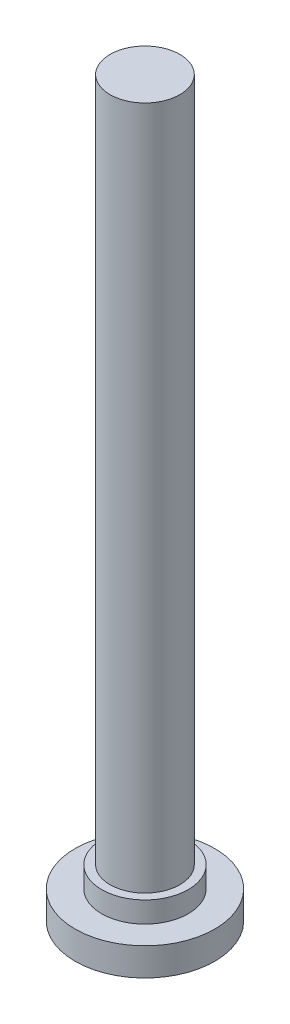
ISO-10303-21;
HEADER;
FILE_DESCRIPTION(('STEP AP214'),'2;1');
FILE_NAME('part.step','',(''),(''),'','','');
FILE_SCHEMA(('AUTOMOTIVE_DESIGN { 1 0 10303 214 1 1 1 1 }'));
ENDSEC;
DATA;
#1=APPLICATION_CONTEXT('core data for automotive mechanical design processes');
#2=APPLICATION_PROTOCOL_DEFINITION('international standard','automotive_design',2000,#1);
#3=PRODUCT_CONTEXT('',#1,'mechanical');
#4=PRODUCT('Part','Part','',(#3));
#5=PRODUCT_RELATED_PRODUCT_CATEGORY('part','',(#4));
#6=PRODUCT_DEFINITION_FORMATION('','',#4);
#7=PRODUCT_DEFINITION_CONTEXT('part definition',#1,'design');
#8=PRODUCT_DEFINITION('design','',#6,#7);
#9=PRODUCT_DEFINITION_SHAPE('','',#8);
#10=(LENGTH_UNIT() NAMED_UNIT(*) SI_UNIT(.MILLI.,.METRE.));
#11=(NAMED_UNIT(*) PLANE_ANGLE_UNIT() SI_UNIT($,.RADIAN.));
#12=(NAMED_UNIT(*) SI_UNIT($,.STERADIAN.) SOLID_ANGLE_UNIT());
#13=UNCERTAINTY_MEASURE_WITH_UNIT(LENGTH_MEASURE(1.E-05),#10,'distance_accuracy_value','');
#14=(GEOMETRIC_REPRESENTATION_CONTEXT(3) GLOBAL_UNCERTAINTY_ASSIGNED_CONTEXT((#13)) GLOBAL_UNIT_ASSIGNED_CONTEXT((#10,
#11,#12)) REPRESENTATION_CONTEXT('',''));
#15=CARTESIAN_POINT('',(0.,0.,0.));
#16=DIRECTION('',(0.,0.,1.));
#17=DIRECTION('',(1.,0.,0.));
#18=AXIS2_PLACEMENT_3D('',#15,#16,#17);
#19=CARTESIAN_POINT('',(0.,-3.5,0.));
#20=DIRECTION('',(0.,-1.,0.));
#21=DIRECTION('',(0.,0.,-1.));
#22=AXIS2_PLACEMENT_3D('',#19,#20,#21);
#23=PLANE('',#22);
#24=CARTESIAN_POINT('',(0.,-3.5,0.));
#25=DIRECTION('',(0.,1.,0.));
#26=DIRECTION('',(0.,0.,-1.));
#27=AXIS2_PLACEMENT_3D('',#24,#25,#26);
#28=CIRCLE('',#27,5.);
#29=CARTESIAN_POINT('',(0.,-3.5,5.));
#30=VERTEX_POINT('',#29);
#31=EDGE_CURVE('E78',#30,#30,#28,.T.);
#32=ORIENTED_EDGE('',*,*,#31,.F.);
#33=EDGE_LOOP('',(#32));
#34=FACE_BOUND('',#33,.T.);
#35=ADVANCED_FACE('F17',(#34),#23,.T.);
#36=CARTESIAN_POINT('',(0.,-1.5,0.));
#37=DIRECTION('',(0.,-1.,0.));
#38=DIRECTION('',(0.,0.,-1.));
#39=AXIS2_PLACEMENT_3D('',#36,#37,#38);
#40=PLANE('',#39);
#41=CARTESIAN_POINT('',(0.,-1.5,0.));
#42=DIRECTION('',(0.,1.,0.));
#43=DIRECTION('',(0.,0.,-1.));
#44=AXIS2_PLACEMENT_3D('',#41,#42,#43);
#45=CIRCLE('',#44,3.1);
#46=CARTESIAN_POINT('',(0.,-1.5,3.1));
#47=VERTEX_POINT('',#46);
#48=EDGE_CURVE('E21',#47,#47,#45,.T.);
#49=ORIENTED_EDGE('',*,*,#48,.F.);
#50=EDGE_LOOP('',(#49));
#51=FACE_BOUND('',#50,.T.);
#52=CARTESIAN_POINT('',(0.,-1.5,0.));
#53=DIRECTION('',(0.,-1.,0.));
#54=DIRECTION('',(0.,0.,-1.));
#55=AXIS2_PLACEMENT_3D('',#52,#53,#54);
#56=CIRCLE('',#55,5.);
#57=CARTESIAN_POINT('',(0.,-1.5,5.));
#58=VERTEX_POINT('',#57);
#59=EDGE_CURVE('E11',#58,#58,#56,.T.);
#60=ORIENTED_EDGE('',*,*,#59,.F.);
#61=EDGE_LOOP('',(#60));
#62=FACE_BOUND('',#61,.T.);
#63=ADVANCED_FACE('F19',(#51,#62),#40,.F.);
#64=CARTESIAN_POINT('',(0.,0.,0.));
#65=DIRECTION('',(0.,-1.,0.));
#66=DIRECTION('',(0.,0.,-1.));
#67=AXIS2_PLACEMENT_3D('',#64,#65,#66);
#68=PLANE('',#67);
#69=CARTESIAN_POINT('',(0.,0.,0.));
#70=DIRECTION('',(0.,1.,0.));
#71=DIRECTION('',(0.,0.,-1.));
#72=AXIS2_PLACEMENT_3D('',#69,#70,#71);
#73=CIRCLE('',#72,2.5);
#74=CARTESIAN_POINT('',(0.,0.,2.5));
#75=VERTEX_POINT('',#74);
#76=EDGE_CURVE('E60',#75,#75,#73,.T.);
#77=ORIENTED_EDGE('',*,*,#76,.F.);
#78=EDGE_LOOP('',(#77));
#79=FACE_BOUND('',#78,.T.);
#80=CARTESIAN_POINT('',(0.,0.,0.));
#81=DIRECTION('',(0.,-1.,0.));
#82=DIRECTION('',(0.,0.,-1.));
#83=AXIS2_PLACEMENT_3D('',#80,#81,#82);
#84=CIRCLE('',#83,3.1);
#85=CARTESIAN_POINT('',(0.,0.,3.1));
#86=VERTEX_POINT('',#85);
#87=EDGE_CURVE('E76',#86,#86,#84,.T.);
#88=ORIENTED_EDGE('',*,*,#87,.F.);
#89=EDGE_LOOP('',(#88));
#90=FACE_BOUND('',#89,.T.);
#91=ADVANCED_FACE('F97',(#79,#90),#68,.F.);
#92=CARTESIAN_POINT('',(0.,49.,0.));
#93=DIRECTION('',(0.,-1.,0.));
#94=DIRECTION('',(0.,0.,-1.));
#95=AXIS2_PLACEMENT_3D('',#92,#93,#94);
#96=PLANE('',#95);
#97=CARTESIAN_POINT('',(0.,49.,0.));
#98=DIRECTION('',(0.,-1.,0.));
#99=DIRECTION('',(0.,0.,-1.));
#100=AXIS2_PLACEMENT_3D('',#97,#98,#99);
#101=CIRCLE('',#100,2.5);
#102=CARTESIAN_POINT('',(0.,49.,2.5));
#103=VERTEX_POINT('',#102);
#104=EDGE_CURVE('E62',#103,#103,#101,.T.);
#105=ORIENTED_EDGE('',*,*,#104,.F.);
#106=EDGE_LOOP('',(#105));
#107=FACE_BOUND('',#106,.T.);
#108=ADVANCED_FACE('F99',(#107),#96,.F.);
#109=CARTESIAN_POINT('',(0.,51.625,0.));
#110=DIRECTION('',(0.,-1.,0.));
#111=DIRECTION('',(0.,0.,-1.));
#112=AXIS2_PLACEMENT_3D('',#109,#110,#111);
#113=CYLINDRICAL_SURFACE('',#112,5.);
#114=ORIENTED_EDGE('',*,*,#31,.T.);
#115=DIRECTION('',(0.,1.,0.));
#116=VECTOR('',#115,1.);
#117=CARTESIAN_POINT('',(0.,51.625,5.));
#118=LINE('',#117,#116);
#119=EDGE_CURVE('E28',#30,#58,#118,.T.);
#120=ORIENTED_EDGE('',*,*,#119,.T.);
#121=ORIENTED_EDGE('',*,*,#59,.T.);
#122=ORIENTED_EDGE('',*,*,#119,.F.);
#123=EDGE_LOOP('',(#114,#120,#121,#122));
#124=FACE_BOUND('',#123,.T.);
#125=ADVANCED_FACE('F106',(#124),#113,.T.);
#126=CARTESIAN_POINT('',(0.,51.625,0.));
#127=DIRECTION('',(0.,-1.,0.));
#128=DIRECTION('',(0.,0.,-1.));
#129=AXIS2_PLACEMENT_3D('',#126,#127,#128);
#130=CYLINDRICAL_SURFACE('',#129,3.1);
#131=ORIENTED_EDGE('',*,*,#48,.T.);
#132=DIRECTION('',(0.,1.,0.));
#133=VECTOR('',#132,1.);
#134=CARTESIAN_POINT('',(0.,51.625,3.1));
#135=LINE('',#134,#133);
#136=EDGE_CURVE('E73',#47,#86,#135,.T.);
#137=ORIENTED_EDGE('',*,*,#136,.T.);
#138=ORIENTED_EDGE('',*,*,#87,.T.);
#139=ORIENTED_EDGE('',*,*,#136,.F.);
#140=EDGE_LOOP('',(#131,#137,#138,#139));
#141=FACE_BOUND('',#140,.T.);
#142=ADVANCED_FACE('F95',(#141),#130,.T.);
#143=CARTESIAN_POINT('',(0.,51.625,0.));
#144=DIRECTION('',(0.,-1.,0.));
#145=DIRECTION('',(0.,0.,-1.));
#146=AXIS2_PLACEMENT_3D('',#143,#144,#145);
#147=CYLINDRICAL_SURFACE('',#146,2.5);
#148=ORIENTED_EDGE('',*,*,#76,.T.);
#149=DIRECTION('',(0.,1.,0.));
#150=VECTOR('',#149,1.);
#151=CARTESIAN_POINT('',(0.,51.625,2.5));
#152=LINE('',#151,#150);
#153=EDGE_CURVE('E57',#75,#103,#152,.T.);
#154=ORIENTED_EDGE('',*,*,#153,.T.);
#155=ORIENTED_EDGE('',*,*,#104,.T.);
#156=ORIENTED_EDGE('',*,*,#153,.F.);
#157=EDGE_LOOP('',(#148,#154,#155,#156));
#158=FACE_BOUND('',#157,.T.);
#159=ADVANCED_FACE('F58',(#158),#147,.T.);
#160=CLOSED_SHELL('',(#35,#63,#91,#108,#125,#142,#159));
#161=MANIFOLD_SOLID_BREP('B1',#160);
#162=ADVANCED_BREP_SHAPE_REPRESENTATION('',(#18,#161),#14);
#163=SHAPE_DEFINITION_REPRESENTATION(#9,#162);
ENDSEC;
END-ISO-10303-21;
